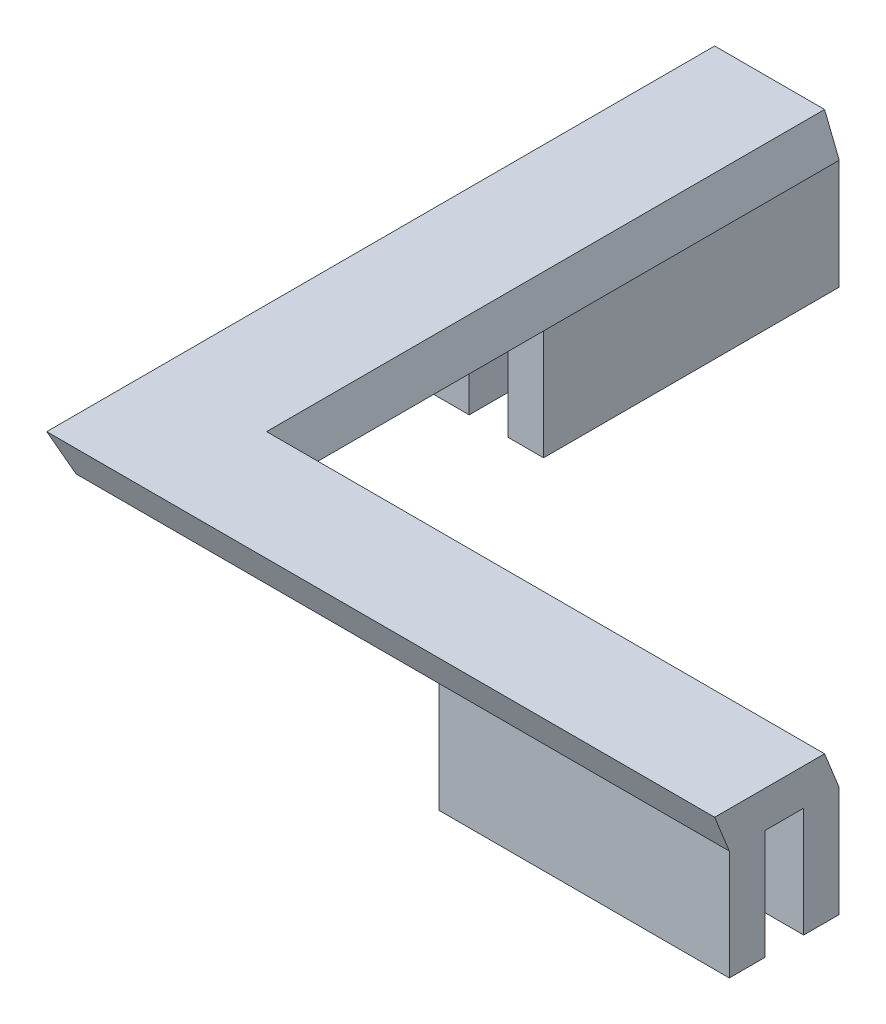
ISO-10303-21;
HEADER;
FILE_DESCRIPTION(('STEP AP214'),'2;1');
FILE_NAME('part.step','',(''),(''),'','','');
FILE_SCHEMA(('AUTOMOTIVE_DESIGN { 1 0 10303 214 1 1 1 1 }'));
ENDSEC;
DATA;
#1=APPLICATION_CONTEXT('core data for automotive mechanical design processes');
#2=APPLICATION_PROTOCOL_DEFINITION('international standard','automotive_design',2000,#1);
#3=PRODUCT_CONTEXT('',#1,'mechanical');
#4=PRODUCT('Part','Part','',(#3));
#5=PRODUCT_RELATED_PRODUCT_CATEGORY('part','',(#4));
#6=PRODUCT_DEFINITION_FORMATION('','',#4);
#7=PRODUCT_DEFINITION_CONTEXT('part definition',#1,'design');
#8=PRODUCT_DEFINITION('design','',#6,#7);
#9=PRODUCT_DEFINITION_SHAPE('','',#8);
#10=(LENGTH_UNIT() NAMED_UNIT(*) SI_UNIT(.MILLI.,.METRE.));
#11=(NAMED_UNIT(*) PLANE_ANGLE_UNIT() SI_UNIT($,.RADIAN.));
#12=(NAMED_UNIT(*) SI_UNIT($,.STERADIAN.) SOLID_ANGLE_UNIT());
#13=UNCERTAINTY_MEASURE_WITH_UNIT(LENGTH_MEASURE(1.E-05),#10,'distance_accuracy_value','');
#14=(GEOMETRIC_REPRESENTATION_CONTEXT(3) GLOBAL_UNCERTAINTY_ASSIGNED_CONTEXT((#13)) GLOBAL_UNIT_ASSIGNED_CONTEXT((#10,
#11,#12)) REPRESENTATION_CONTEXT('',''));
#15=CARTESIAN_POINT('',(0.,0.,0.));
#16=DIRECTION('',(0.,0.,1.));
#17=DIRECTION('',(1.,0.,0.));
#18=AXIS2_PLACEMENT_3D('',#15,#16,#17);
#19=CARTESIAN_POINT('',(0.,0.,0.));
#20=DIRECTION('',(0.,1.,0.));
#21=DIRECTION('',(0.,0.,1.));
#22=AXIS2_PLACEMENT_3D('',#19,#20,#21);
#23=PLANE('',#22);
#24=DIRECTION('',(0.,0.,-1.));
#25=VECTOR('',#24,1.);
#26=CARTESIAN_POINT('',(113.220499999994,0.,0.));
#27=LINE('',#26,#25);
#28=CARTESIAN_POINT('',(113.220499999994,0.,-6.15949999999999));
#29=VERTEX_POINT('',#28);
#30=CARTESIAN_POINT('',(113.220499999994,0.,-12.8905));
#31=VERTEX_POINT('',#30);
#32=EDGE_CURVE('E211',#29,#31,#27,.T.);
#33=ORIENTED_EDGE('',*,*,#32,.F.);
#34=DIRECTION('',(1.,0.,0.));
#35=VECTOR('',#34,1.);
#36=CARTESIAN_POINT('',(164.464999999989,0.,-6.15949999999999));
#37=LINE('',#36,#35);
#38=CARTESIAN_POINT('',(62.8649999999887,0.,-6.1595));
#39=VERTEX_POINT('',#38);
#40=EDGE_CURVE('E285',#39,#29,#37,.T.);
#41=ORIENTED_EDGE('',*,*,#40,.F.);
#42=DIRECTION('',(0.,0.,-1.));
#43=VECTOR('',#42,1.);
#44=CARTESIAN_POINT('',(62.8649999999887,0.,-6.1595));
#45=LINE('',#44,#43);
#46=CARTESIAN_POINT('',(62.8649999999887,0.,0.));
#47=VERTEX_POINT('',#46);
#48=EDGE_CURVE('E288',#47,#39,#45,.T.);
#49=ORIENTED_EDGE('',*,*,#48,.F.);
#50=DIRECTION('',(1.,0.,0.));
#51=VECTOR('',#50,1.);
#52=CARTESIAN_POINT('',(0.,0.,0.));
#53=LINE('',#52,#51);
#54=CARTESIAN_POINT('',(0.,0.,0.));
#55=VERTEX_POINT('',#54);
#56=EDGE_CURVE('E472',#55,#47,#53,.T.);
#57=ORIENTED_EDGE('',*,*,#56,.F.);
#58=DIRECTION('',(0.,0.,-1.));
#59=VECTOR('',#58,1.);
#60=CARTESIAN_POINT('',(0.,0.,0.));
#61=LINE('',#60,#59);
#62=CARTESIAN_POINT('',(0.,0.,-61.976));
#63=VERTEX_POINT('',#62);
#64=EDGE_CURVE('E333',#55,#63,#61,.T.);
#65=ORIENTED_EDGE('',*,*,#64,.T.);
#66=DIRECTION('',(-1.,0.,0.));
#67=VECTOR('',#66,1.);
#68=CARTESIAN_POINT('',(0.,0.,-61.976));
#69=LINE('',#68,#67);
#70=CARTESIAN_POINT('',(6.1595,0.,-61.976));
#71=VERTEX_POINT('',#70);
#72=EDGE_CURVE('E323',#71,#63,#69,.T.);
#73=ORIENTED_EDGE('',*,*,#72,.F.);
#74=DIRECTION('',(0.,0.,1.));
#75=VECTOR('',#74,1.);
#76=CARTESIAN_POINT('',(6.1595,0.,-61.976));
#77=LINE('',#76,#75);
#78=CARTESIAN_POINT('',(6.1595,0.,-113.220499999994));
#79=VERTEX_POINT('',#78);
#80=EDGE_CURVE('E321',#79,#71,#77,.T.);
#81=ORIENTED_EDGE('',*,*,#80,.F.);
#82=DIRECTION('',(-1.,0.,0.));
#83=VECTOR('',#82,1.);
#84=CARTESIAN_POINT('',(0.,0.,-113.220499999994));
#85=LINE('',#84,#83);
#86=CARTESIAN_POINT('',(12.8905,0.,-113.220499999994));
#87=VERTEX_POINT('',#86);
#88=EDGE_CURVE('E238',#87,#79,#85,.T.);
#89=ORIENTED_EDGE('',*,*,#88,.F.);
#90=DIRECTION('',(0.,0.,-1.));
#91=VECTOR('',#90,1.);
#92=CARTESIAN_POINT('',(12.8905,0.,-61.976));
#93=LINE('',#92,#91);
#94=CARTESIAN_POINT('',(12.8905,0.,-61.976));
#95=VERTEX_POINT('',#94);
#96=EDGE_CURVE('E302',#95,#87,#93,.T.);
#97=ORIENTED_EDGE('',*,*,#96,.F.);
#98=DIRECTION('',(-1.,0.,0.));
#99=VECTOR('',#98,1.);
#100=CARTESIAN_POINT('',(19.05,0.,-61.9759999999999));
#101=LINE('',#100,#99);
#102=CARTESIAN_POINT('',(19.05,0.,-61.9759999999999));
#103=VERTEX_POINT('',#102);
#104=EDGE_CURVE('E305',#103,#95,#101,.T.);
#105=ORIENTED_EDGE('',*,*,#104,.F.);
#106=DIRECTION('',(0.,0.,-1.));
#107=VECTOR('',#106,1.);
#108=CARTESIAN_POINT('',(19.05,0.,-19.05));
#109=LINE('',#108,#107);
#110=CARTESIAN_POINT('',(19.05,0.,-19.05));
#111=VERTEX_POINT('',#110);
#112=EDGE_CURVE('E495',#111,#103,#109,.T.);
#113=ORIENTED_EDGE('',*,*,#112,.F.);
#114=DIRECTION('',(-1.,0.,0.));
#115=VECTOR('',#114,1.);
#116=CARTESIAN_POINT('',(208.28,0.,-19.05));
#117=LINE('',#116,#115);
#118=CARTESIAN_POINT('',(62.8649999999887,0.,-19.05));
#119=VERTEX_POINT('',#118);
#120=EDGE_CURVE('E498',#119,#111,#117,.T.);
#121=ORIENTED_EDGE('',*,*,#120,.F.);
#122=DIRECTION('',(0.,0.,-1.));
#123=VECTOR('',#122,1.);
#124=CARTESIAN_POINT('',(62.8649999999888,0.,-12.8905));
#125=LINE('',#124,#123);
#126=CARTESIAN_POINT('',(62.8649999999888,0.,-12.8905));
#127=VERTEX_POINT('',#126);
#128=EDGE_CURVE('E284',#127,#119,#125,.T.);
#129=ORIENTED_EDGE('',*,*,#128,.F.);
#130=DIRECTION('',(-1.,0.,0.));
#131=VECTOR('',#130,1.);
#132=CARTESIAN_POINT('',(164.464999999989,0.,-12.8905));
#133=LINE('',#132,#131);
#134=EDGE_CURVE('E271',#31,#127,#133,.T.);
#135=ORIENTED_EDGE('',*,*,#134,.F.);
#136=EDGE_LOOP('',(#33,#41,#49,#57,#65,#73,#81,#89,#97,#105,#113,#121,#129,#135));
#137=FACE_BOUND('',#136,.T.);
#138=ADVANCED_FACE('F57',(#137),#23,.F.);
#139=CARTESIAN_POINT('',(0.,0.,0.));
#140=DIRECTION('',(0.,-0.371390676354104,0.928476690885259));
#141=DIRECTION('',(0.,-0.928476690885259,-0.371390676354104));
#142=AXIS2_PLACEMENT_3D('',#139,#140,#141);
#143=PLANE('',#142);
#144=DIRECTION('',(1.,0.,0.));
#145=VECTOR('',#144,1.);
#146=CARTESIAN_POINT('',(0.,6.35,2.54));
#147=LINE('',#146,#145);
#148=CARTESIAN_POINT('',(-2.53999999999998,6.34999999999998,2.53999999999999));
#149=VERTEX_POINT('',#148);
#150=CARTESIAN_POINT('',(113.220499999994,6.35,2.54));
#151=VERTEX_POINT('',#150);
#152=EDGE_CURVE('E73',#149,#151,#147,.T.);
#153=ORIENTED_EDGE('',*,*,#152,.F.);
#154=DIRECTION('',(0.348155311911396,-0.870388279778489,-0.348155311911396));
#155=VECTOR('',#154,1.);
#156=CARTESIAN_POINT('',(-50.8,127.,50.8));
#157=LINE('',#156,#155);
#158=EDGE_CURVE('E61',#149,#55,#157,.T.);
#159=ORIENTED_EDGE('',*,*,#158,.T.);
#160=ORIENTED_EDGE('',*,*,#56,.T.);
#161=DIRECTION('',(-1.,0.,0.));
#162=VECTOR('',#161,1.);
#163=CARTESIAN_POINT('',(164.464999999989,0.,0.));
#164=LINE('',#163,#162);
#165=CARTESIAN_POINT('',(113.220499999994,0.,0.));
#166=VERTEX_POINT('',#165);
#167=EDGE_CURVE('E218',#166,#47,#164,.T.);
#168=ORIENTED_EDGE('',*,*,#167,.F.);
#169=DIRECTION('',(0.,0.928476690885259,0.371390676354104));
#170=VECTOR('',#169,1.);
#171=CARTESIAN_POINT('',(113.220499999994,0.,0.));
#172=LINE('',#171,#170);
#173=EDGE_CURVE('E226',#166,#151,#172,.T.);
#174=ORIENTED_EDGE('',*,*,#173,.T.);
#175=EDGE_LOOP('',(#153,#159,#160,#168,#174));
#176=FACE_BOUND('',#175,.T.);
#177=ADVANCED_FACE('F454',(#176),#143,.T.);
#178=CARTESIAN_POINT('',(0.,6.56896551724138,-16.4224137931034));
#179=DIRECTION('',(0.,0.371390676354104,-0.928476690885259));
#180=DIRECTION('',(0.,0.928476690885259,0.371390676354104));
#181=AXIS2_PLACEMENT_3D('',#178,#179,#180);
#182=PLANE('',#181);
#183=DIRECTION('',(-1.,0.,0.));
#184=VECTOR('',#183,1.);
#185=CARTESIAN_POINT('',(0.,6.35,-16.51));
#186=LINE('',#185,#184);
#187=CARTESIAN_POINT('',(113.220499999994,6.35,-16.51));
#188=VERTEX_POINT('',#187);
#189=CARTESIAN_POINT('',(16.51,6.35,-16.51));
#190=VERTEX_POINT('',#189);
#191=EDGE_CURVE('E194',#188,#190,#186,.T.);
#192=ORIENTED_EDGE('',*,*,#191,.F.);
#193=DIRECTION('',(0.,-0.928476690885259,-0.371390676354104));
#194=VECTOR('',#193,1.);
#195=CARTESIAN_POINT('',(113.220499999994,6.56896551724138,-16.4224137931034));
#196=LINE('',#195,#194);
#197=CARTESIAN_POINT('',(113.220499999994,0.,-19.05));
#198=VERTEX_POINT('',#197);
#199=EDGE_CURVE('E202',#188,#198,#196,.T.);
#200=ORIENTED_EDGE('',*,*,#199,.T.);
#201=DIRECTION('',(1.,0.,0.));
#202=VECTOR('',#201,1.);
#203=CARTESIAN_POINT('',(164.464999999989,0.,-19.05));
#204=LINE('',#203,#202);
#205=EDGE_CURVE('E273',#119,#198,#204,.T.);
#206=ORIENTED_EDGE('',*,*,#205,.F.);
#207=ORIENTED_EDGE('',*,*,#120,.T.);
#208=DIRECTION('',(-0.348155311911396,0.870388279778489,0.348155311911396));
#209=VECTOR('',#208,1.);
#210=CARTESIAN_POINT('',(19.05,0.,-19.05));
#211=LINE('',#210,#209);
#212=EDGE_CURVE('E205',#111,#190,#211,.T.);
#213=ORIENTED_EDGE('',*,*,#212,.T.);
#214=EDGE_LOOP('',(#192,#200,#206,#207,#213));
#215=FACE_BOUND('',#214,.T.);
#216=ADVANCED_FACE('F200',(#215),#182,.T.);
#217=CARTESIAN_POINT('',(164.464999999989,-19.05,-6.15949999999999));
#218=DIRECTION('',(0.,0.,1.));
#219=DIRECTION('',(1.,0.,0.));
#220=AXIS2_PLACEMENT_3D('',#217,#218,#219);
#221=PLANE('',#220);
#222=DIRECTION('',(0.,1.,0.));
#223=VECTOR('',#222,1.);
#224=CARTESIAN_POINT('',(113.220499999994,-19.05,-6.15949999999999));
#225=LINE('',#224,#223);
#226=CARTESIAN_POINT('',(113.220499999994,-19.05,-6.15949999999999));
#227=VERTEX_POINT('',#226);
#228=EDGE_CURVE('E213',#227,#29,#225,.T.);
#229=ORIENTED_EDGE('',*,*,#228,.F.);
#230=DIRECTION('',(1.,0.,0.));
#231=VECTOR('',#230,1.);
#232=CARTESIAN_POINT('',(164.464999999989,-19.05,-6.15949999999999));
#233=LINE('',#232,#231);
#234=CARTESIAN_POINT('',(62.8649999999887,-19.05,-6.1595));
#235=VERTEX_POINT('',#234);
#236=EDGE_CURVE('E291',#235,#227,#233,.T.);
#237=ORIENTED_EDGE('',*,*,#236,.F.);
#238=DIRECTION('',(0.,1.,0.));
#239=VECTOR('',#238,1.);
#240=CARTESIAN_POINT('',(62.8649999999887,-19.05,-6.1595));
#241=LINE('',#240,#239);
#242=EDGE_CURVE('E281',#235,#39,#241,.T.);
#243=ORIENTED_EDGE('',*,*,#242,.T.);
#244=ORIENTED_EDGE('',*,*,#40,.T.);
#245=EDGE_LOOP('',(#229,#237,#243,#244));
#246=FACE_BOUND('',#245,.T.);
#247=ADVANCED_FACE('F378',(#246),#221,.F.);
#248=CARTESIAN_POINT('',(164.464999999989,-19.05,0.));
#249=DIRECTION('',(0.,0.,-1.));
#250=DIRECTION('',(-1.,0.,0.));
#251=AXIS2_PLACEMENT_3D('',#248,#249,#250);
#252=PLANE('',#251);
#253=DIRECTION('',(0.,-1.,0.));
#254=VECTOR('',#253,1.);
#255=CARTESIAN_POINT('',(113.220499999994,-19.05,0.));
#256=LINE('',#255,#254);
#257=CARTESIAN_POINT('',(113.220499999994,-19.05,0.));
#258=VERTEX_POINT('',#257);
#259=EDGE_CURVE('E233',#166,#258,#256,.T.);
#260=ORIENTED_EDGE('',*,*,#259,.F.);
#261=ORIENTED_EDGE('',*,*,#167,.T.);
#262=DIRECTION('',(0.,1.,0.));
#263=VECTOR('',#262,1.);
#264=CARTESIAN_POINT('',(62.8649999999887,-19.05,0.));
#265=LINE('',#264,#263);
#266=CARTESIAN_POINT('',(62.8649999999887,-19.05,0.));
#267=VERTEX_POINT('',#266);
#268=EDGE_CURVE('E283',#267,#47,#265,.T.);
#269=ORIENTED_EDGE('',*,*,#268,.F.);
#270=DIRECTION('',(-1.,0.,0.));
#271=VECTOR('',#270,1.);
#272=CARTESIAN_POINT('',(164.464999999989,-19.05,0.));
#273=LINE('',#272,#271);
#274=EDGE_CURVE('E289',#258,#267,#273,.T.);
#275=ORIENTED_EDGE('',*,*,#274,.F.);
#276=EDGE_LOOP('',(#260,#261,#269,#275));
#277=FACE_BOUND('',#276,.T.);
#278=ADVANCED_FACE('F367',(#277),#252,.F.);
#279=CARTESIAN_POINT('',(0.,-19.05,0.));
#280=DIRECTION('',(0.,-1.,0.));
#281=DIRECTION('',(0.,0.,-1.));
#282=AXIS2_PLACEMENT_3D('',#279,#280,#281);
#283=PLANE('',#282);
#284=ORIENTED_EDGE('',*,*,#236,.T.);
#285=DIRECTION('',(0.,0.,1.));
#286=VECTOR('',#285,1.);
#287=CARTESIAN_POINT('',(113.220499999994,-19.05,0.));
#288=LINE('',#287,#286);
#289=EDGE_CURVE('E228',#227,#258,#288,.T.);
#290=ORIENTED_EDGE('',*,*,#289,.T.);
#291=ORIENTED_EDGE('',*,*,#274,.T.);
#292=DIRECTION('',(0.,0.,-1.));
#293=VECTOR('',#292,1.);
#294=CARTESIAN_POINT('',(62.8649999999887,-19.05,-6.1595));
#295=LINE('',#294,#293);
#296=EDGE_CURVE('E294',#267,#235,#295,.T.);
#297=ORIENTED_EDGE('',*,*,#296,.T.);
#298=EDGE_LOOP('',(#284,#290,#291,#297));
#299=FACE_BOUND('',#298,.T.);
#300=ADVANCED_FACE('F377',(#299),#283,.T.);
#301=CARTESIAN_POINT('',(164.464999999989,-19.05,-19.05));
#302=DIRECTION('',(0.,0.,1.));
#303=DIRECTION('',(1.,0.,0.));
#304=AXIS2_PLACEMENT_3D('',#301,#302,#303);
#305=PLANE('',#304);
#306=DIRECTION('',(0.,1.,0.));
#307=VECTOR('',#306,1.);
#308=CARTESIAN_POINT('',(113.220499999994,-19.05,-19.05));
#309=LINE('',#308,#307);
#310=CARTESIAN_POINT('',(113.220499999994,-19.05,-19.05));
#311=VERTEX_POINT('',#310);
#312=EDGE_CURVE('E209',#311,#198,#309,.T.);
#313=ORIENTED_EDGE('',*,*,#312,.F.);
#314=DIRECTION('',(1.,0.,0.));
#315=VECTOR('',#314,1.);
#316=CARTESIAN_POINT('',(164.464999999989,-19.05,-19.05));
#317=LINE('',#316,#315);
#318=CARTESIAN_POINT('',(62.8649999999887,-19.05,-19.05));
#319=VERTEX_POINT('',#318);
#320=EDGE_CURVE('E276',#319,#311,#317,.T.);
#321=ORIENTED_EDGE('',*,*,#320,.F.);
#322=DIRECTION('',(0.,1.,0.));
#323=VECTOR('',#322,1.);
#324=CARTESIAN_POINT('',(62.8649999999887,-19.05,-19.05));
#325=LINE('',#324,#323);
#326=EDGE_CURVE('E264',#319,#119,#325,.T.);
#327=ORIENTED_EDGE('',*,*,#326,.T.);
#328=ORIENTED_EDGE('',*,*,#205,.T.);
#329=EDGE_LOOP('',(#313,#321,#327,#328));
#330=FACE_BOUND('',#329,.T.);
#331=ADVANCED_FACE('F381',(#330),#305,.F.);
#332=CARTESIAN_POINT('',(164.464999999989,-19.05,-12.8905));
#333=DIRECTION('',(0.,0.,-1.));
#334=DIRECTION('',(-1.,0.,0.));
#335=AXIS2_PLACEMENT_3D('',#332,#333,#334);
#336=PLANE('',#335);
#337=DIRECTION('',(0.,-1.,0.));
#338=VECTOR('',#337,1.);
#339=CARTESIAN_POINT('',(113.220499999994,-19.05,-12.8905));
#340=LINE('',#339,#338);
#341=CARTESIAN_POINT('',(113.220499999994,-19.05,-12.8905));
#342=VERTEX_POINT('',#341);
#343=EDGE_CURVE('E81',#31,#342,#340,.T.);
#344=ORIENTED_EDGE('',*,*,#343,.F.);
#345=ORIENTED_EDGE('',*,*,#134,.T.);
#346=DIRECTION('',(0.,1.,0.));
#347=VECTOR('',#346,1.);
#348=CARTESIAN_POINT('',(62.8649999999888,-19.05,-12.8905));
#349=LINE('',#348,#347);
#350=CARTESIAN_POINT('',(62.8649999999888,-19.05,-12.8905));
#351=VERTEX_POINT('',#350);
#352=EDGE_CURVE('E267',#351,#127,#349,.T.);
#353=ORIENTED_EDGE('',*,*,#352,.F.);
#354=DIRECTION('',(-1.,0.,0.));
#355=VECTOR('',#354,1.);
#356=CARTESIAN_POINT('',(164.464999999989,-19.05,-12.8905));
#357=LINE('',#356,#355);
#358=EDGE_CURVE('E270',#342,#351,#357,.T.);
#359=ORIENTED_EDGE('',*,*,#358,.F.);
#360=EDGE_LOOP('',(#344,#345,#353,#359));
#361=FACE_BOUND('',#360,.T.);
#362=ADVANCED_FACE('F572',(#361),#336,.F.);
#363=CARTESIAN_POINT('',(0.,-19.05,0.));
#364=DIRECTION('',(0.,1.,0.));
#365=DIRECTION('',(0.,0.,1.));
#366=AXIS2_PLACEMENT_3D('',#363,#364,#365);
#367=PLANE('',#366);
#368=DIRECTION('',(0.,0.,-1.));
#369=VECTOR('',#368,1.);
#370=CARTESIAN_POINT('',(113.220499999994,-19.05,0.));
#371=LINE('',#370,#369);
#372=EDGE_CURVE('E67',#342,#311,#371,.T.);
#373=ORIENTED_EDGE('',*,*,#372,.F.);
#374=ORIENTED_EDGE('',*,*,#358,.T.);
#375=DIRECTION('',(0.,0.,-1.));
#376=VECTOR('',#375,1.);
#377=CARTESIAN_POINT('',(62.8649999999888,-19.05,-12.8905));
#378=LINE('',#377,#376);
#379=EDGE_CURVE('E274',#351,#319,#378,.T.);
#380=ORIENTED_EDGE('',*,*,#379,.T.);
#381=ORIENTED_EDGE('',*,*,#320,.T.);
#382=EDGE_LOOP('',(#373,#374,#380,#381));
#383=FACE_BOUND('',#382,.T.);
#384=ADVANCED_FACE('F451',(#383),#367,.F.);
#385=CARTESIAN_POINT('',(0.,0.,0.));
#386=DIRECTION('',(0.928476690885259,0.371390676354104,0.));
#387=DIRECTION('',(-0.371390676354104,0.928476690885259,0.));
#388=AXIS2_PLACEMENT_3D('',#385,#386,#387);
#389=PLANE('',#388);
#390=ORIENTED_EDGE('',*,*,#158,.F.);
#391=DIRECTION('',(0.,0.,-1.));
#392=VECTOR('',#391,1.);
#393=CARTESIAN_POINT('',(-2.54,6.35,0.));
#394=LINE('',#393,#392);
#395=CARTESIAN_POINT('',(-2.54,6.35,-113.220499999994));
#396=VERTEX_POINT('',#395);
#397=EDGE_CURVE('E795',#149,#396,#394,.T.);
#398=ORIENTED_EDGE('',*,*,#397,.T.);
#399=DIRECTION('',(-0.371390676354104,0.928476690885259,0.));
#400=VECTOR('',#399,1.);
#401=CARTESIAN_POINT('',(0.,0.,-113.220499999994));
#402=LINE('',#401,#400);
#403=CARTESIAN_POINT('',(0.,0.,-113.220499999994));
#404=VERTEX_POINT('',#403);
#405=EDGE_CURVE('E259',#404,#396,#402,.T.);
#406=ORIENTED_EDGE('',*,*,#405,.F.);
#407=DIRECTION('',(0.,0.,-1.));
#408=VECTOR('',#407,1.);
#409=CARTESIAN_POINT('',(0.,0.,-61.976));
#410=LINE('',#409,#408);
#411=EDGE_CURVE('E315',#63,#404,#410,.T.);
#412=ORIENTED_EDGE('',*,*,#411,.F.);
#413=ORIENTED_EDGE('',*,*,#64,.F.);
#414=EDGE_LOOP('',(#390,#398,#406,#412,#413));
#415=FACE_BOUND('',#414,.T.);
#416=ADVANCED_FACE('F441',(#415),#389,.F.);
#417=CARTESIAN_POINT('',(16.4224137931034,6.56896551724138,0.));
#418=DIRECTION('',(0.928476690885259,0.371390676354104,0.));
#419=DIRECTION('',(-0.371390676354104,0.928476690885259,0.));
#420=AXIS2_PLACEMENT_3D('',#417,#418,#419);
#421=PLANE('',#420);
#422=DIRECTION('',(0.,0.,-1.));
#423=VECTOR('',#422,1.);
#424=CARTESIAN_POINT('',(16.51,6.35,0.));
#425=LINE('',#424,#423);
#426=CARTESIAN_POINT('',(16.51,6.35,-113.220499999994));
#427=VERTEX_POINT('',#426);
#428=EDGE_CURVE('E798',#190,#427,#425,.T.);
#429=ORIENTED_EDGE('',*,*,#428,.F.);
#430=ORIENTED_EDGE('',*,*,#212,.F.);
#431=ORIENTED_EDGE('',*,*,#112,.T.);
#432=DIRECTION('',(0.,0.,1.));
#433=VECTOR('',#432,1.);
#434=CARTESIAN_POINT('',(19.05,0.,-61.9759999999999));
#435=LINE('',#434,#433);
#436=CARTESIAN_POINT('',(19.05,0.,-113.220499999994));
#437=VERTEX_POINT('',#436);
#438=EDGE_CURVE('E324',#437,#103,#435,.T.);
#439=ORIENTED_EDGE('',*,*,#438,.F.);
#440=DIRECTION('',(-0.371390676354104,0.928476690885259,0.));
#441=VECTOR('',#440,1.);
#442=CARTESIAN_POINT('',(16.4224137931034,6.56896551724138,-113.220499999994));
#443=LINE('',#442,#441);
#444=EDGE_CURVE('E241',#437,#427,#443,.T.);
#445=ORIENTED_EDGE('',*,*,#444,.T.);
#446=EDGE_LOOP('',(#429,#430,#431,#439,#445));
#447=FACE_BOUND('',#446,.T.);
#448=ADVANCED_FACE('F450',(#447),#421,.T.);
#449=CARTESIAN_POINT('',(6.1595,-19.05,-61.976));
#450=DIRECTION('',(-1.,0.,0.));
#451=DIRECTION('',(0.,0.,1.));
#452=AXIS2_PLACEMENT_3D('',#449,#450,#451);
#453=PLANE('',#452);
#454=DIRECTION('',(0.,-1.,0.));
#455=VECTOR('',#454,1.);
#456=CARTESIAN_POINT('',(6.1595,-19.05,-113.220499999994));
#457=LINE('',#456,#455);
#458=CARTESIAN_POINT('',(6.1595,-19.05,-113.220499999994));
#459=VERTEX_POINT('',#458);
#460=EDGE_CURVE('E240',#79,#459,#457,.T.);
#461=ORIENTED_EDGE('',*,*,#460,.F.);
#462=ORIENTED_EDGE('',*,*,#80,.T.);
#463=DIRECTION('',(0.,1.,0.));
#464=VECTOR('',#463,1.);
#465=CARTESIAN_POINT('',(6.1595,-19.05,-61.976));
#466=LINE('',#465,#464);
#467=CARTESIAN_POINT('',(6.1595,-19.05,-61.976));
#468=VERTEX_POINT('',#467);
#469=EDGE_CURVE('E327',#468,#71,#466,.T.);
#470=ORIENTED_EDGE('',*,*,#469,.F.);
#471=DIRECTION('',(0.,0.,1.));
#472=VECTOR('',#471,1.);
#473=CARTESIAN_POINT('',(6.1595,-19.05,-61.976));
#474=LINE('',#473,#472);
#475=EDGE_CURVE('E312',#459,#468,#474,.T.);
#476=ORIENTED_EDGE('',*,*,#475,.F.);
#477=EDGE_LOOP('',(#461,#462,#470,#476));
#478=FACE_BOUND('',#477,.T.);
#479=ADVANCED_FACE('F410',(#478),#453,.F.);
#480=CARTESIAN_POINT('',(0.,-19.05,-61.976));
#481=DIRECTION('',(1.,0.,0.));
#482=DIRECTION('',(0.,0.,-1.));
#483=AXIS2_PLACEMENT_3D('',#480,#481,#482);
#484=PLANE('',#483);
#485=DIRECTION('',(0.,1.,0.));
#486=VECTOR('',#485,1.);
#487=CARTESIAN_POINT('',(0.,-19.05,-113.220499999994));
#488=LINE('',#487,#486);
#489=CARTESIAN_POINT('',(0.,-19.05,-113.220499999994));
#490=VERTEX_POINT('',#489);
#491=EDGE_CURVE('E257',#490,#404,#488,.T.);
#492=ORIENTED_EDGE('',*,*,#491,.F.);
#493=DIRECTION('',(0.,0.,-1.));
#494=VECTOR('',#493,1.);
#495=CARTESIAN_POINT('',(0.,-19.05,-61.976));
#496=LINE('',#495,#494);
#497=CARTESIAN_POINT('',(0.,-19.05,-61.976));
#498=VERTEX_POINT('',#497);
#499=EDGE_CURVE('E317',#498,#490,#496,.T.);
#500=ORIENTED_EDGE('',*,*,#499,.F.);
#501=DIRECTION('',(0.,1.,0.));
#502=VECTOR('',#501,1.);
#503=CARTESIAN_POINT('',(0.,-19.05,-61.976));
#504=LINE('',#503,#502);
#505=EDGE_CURVE('E320',#498,#63,#504,.T.);
#506=ORIENTED_EDGE('',*,*,#505,.T.);
#507=ORIENTED_EDGE('',*,*,#411,.T.);
#508=EDGE_LOOP('',(#492,#500,#506,#507));
#509=FACE_BOUND('',#508,.T.);
#510=ADVANCED_FACE('F405',(#509),#484,.F.);
#511=CARTESIAN_POINT('',(0.,-19.05,0.));
#512=DIRECTION('',(0.,-1.,0.));
#513=DIRECTION('',(0.,0.,-1.));
#514=AXIS2_PLACEMENT_3D('',#511,#512,#513);
#515=PLANE('',#514);
#516=ORIENTED_EDGE('',*,*,#499,.T.);
#517=DIRECTION('',(1.,0.,0.));
#518=VECTOR('',#517,1.);
#519=CARTESIAN_POINT('',(0.,-19.05,-113.220499999994));
#520=LINE('',#519,#518);
#521=EDGE_CURVE('E254',#490,#459,#520,.T.);
#522=ORIENTED_EDGE('',*,*,#521,.T.);
#523=ORIENTED_EDGE('',*,*,#475,.T.);
#524=DIRECTION('',(-1.,0.,0.));
#525=VECTOR('',#524,1.);
#526=CARTESIAN_POINT('',(0.,-19.05,-61.976));
#527=LINE('',#526,#525);
#528=EDGE_CURVE('E314',#468,#498,#527,.T.);
#529=ORIENTED_EDGE('',*,*,#528,.T.);
#530=EDGE_LOOP('',(#516,#522,#523,#529));
#531=FACE_BOUND('',#530,.T.);
#532=ADVANCED_FACE('F388',(#531),#515,.T.);
#533=CARTESIAN_POINT('',(19.05,-19.05,-61.9759999999999));
#534=DIRECTION('',(-1.,0.,0.));
#535=DIRECTION('',(0.,0.,1.));
#536=AXIS2_PLACEMENT_3D('',#533,#534,#535);
#537=PLANE('',#536);
#538=DIRECTION('',(0.,-1.,0.));
#539=VECTOR('',#538,1.);
#540=CARTESIAN_POINT('',(19.05,-19.05,-113.220499999994));
#541=LINE('',#540,#539);
#542=CARTESIAN_POINT('',(19.05,-19.05,-113.220499999994));
#543=VERTEX_POINT('',#542);
#544=EDGE_CURVE('E245',#437,#543,#541,.T.);
#545=ORIENTED_EDGE('',*,*,#544,.F.);
#546=ORIENTED_EDGE('',*,*,#438,.T.);
#547=DIRECTION('',(0.,1.,0.));
#548=VECTOR('',#547,1.);
#549=CARTESIAN_POINT('',(19.05,-19.05,-61.9759999999999));
#550=LINE('',#549,#548);
#551=CARTESIAN_POINT('',(19.05,-19.05,-61.9759999999999));
#552=VERTEX_POINT('',#551);
#553=EDGE_CURVE('E301',#552,#103,#550,.T.);
#554=ORIENTED_EDGE('',*,*,#553,.F.);
#555=DIRECTION('',(0.,0.,1.));
#556=VECTOR('',#555,1.);
#557=CARTESIAN_POINT('',(19.05,-19.05,-61.9759999999999));
#558=LINE('',#557,#556);
#559=EDGE_CURVE('E306',#543,#552,#558,.T.);
#560=ORIENTED_EDGE('',*,*,#559,.F.);
#561=EDGE_LOOP('',(#545,#546,#554,#560));
#562=FACE_BOUND('',#561,.T.);
#563=ADVANCED_FACE('F383',(#562),#537,.F.);
#564=CARTESIAN_POINT('',(12.8905,-19.05,-61.976));
#565=DIRECTION('',(1.,0.,0.));
#566=DIRECTION('',(0.,0.,-1.));
#567=AXIS2_PLACEMENT_3D('',#564,#565,#566);
#568=PLANE('',#567);
#569=DIRECTION('',(0.,1.,0.));
#570=VECTOR('',#569,1.);
#571=CARTESIAN_POINT('',(12.8905,-19.05,-113.220499999994));
#572=LINE('',#571,#570);
#573=CARTESIAN_POINT('',(12.8905,-19.05,-113.220499999994));
#574=VERTEX_POINT('',#573);
#575=EDGE_CURVE('E243',#574,#87,#572,.T.);
#576=ORIENTED_EDGE('',*,*,#575,.F.);
#577=DIRECTION('',(0.,0.,-1.));
#578=VECTOR('',#577,1.);
#579=CARTESIAN_POINT('',(12.8905,-19.05,-61.976));
#580=LINE('',#579,#578);
#581=CARTESIAN_POINT('',(12.8905,-19.05,-61.976));
#582=VERTEX_POINT('',#581);
#583=EDGE_CURVE('E300',#582,#574,#580,.T.);
#584=ORIENTED_EDGE('',*,*,#583,.F.);
#585=DIRECTION('',(0.,1.,0.));
#586=VECTOR('',#585,1.);
#587=CARTESIAN_POINT('',(12.8905,-19.05,-61.976));
#588=LINE('',#587,#586);
#589=EDGE_CURVE('E297',#582,#95,#588,.T.);
#590=ORIENTED_EDGE('',*,*,#589,.T.);
#591=ORIENTED_EDGE('',*,*,#96,.T.);
#592=EDGE_LOOP('',(#576,#584,#590,#591));
#593=FACE_BOUND('',#592,.T.);
#594=ADVANCED_FACE('F387',(#593),#568,.F.);
#595=CARTESIAN_POINT('',(0.,-19.05,0.));
#596=DIRECTION('',(0.,1.,0.));
#597=DIRECTION('',(0.,0.,1.));
#598=AXIS2_PLACEMENT_3D('',#595,#596,#597);
#599=PLANE('',#598);
#600=DIRECTION('',(-1.,0.,0.));
#601=VECTOR('',#600,1.);
#602=CARTESIAN_POINT('',(0.,-19.05,-113.220499999994));
#603=LINE('',#602,#601);
#604=EDGE_CURVE('E235',#543,#574,#603,.T.);
#605=ORIENTED_EDGE('',*,*,#604,.F.);
#606=ORIENTED_EDGE('',*,*,#559,.T.);
#607=DIRECTION('',(-1.,0.,0.));
#608=VECTOR('',#607,1.);
#609=CARTESIAN_POINT('',(19.05,-19.05,-61.9759999999999));
#610=LINE('',#609,#608);
#611=EDGE_CURVE('E309',#552,#582,#610,.T.);
#612=ORIENTED_EDGE('',*,*,#611,.T.);
#613=ORIENTED_EDGE('',*,*,#583,.T.);
#614=EDGE_LOOP('',(#605,#606,#612,#613));
#615=FACE_BOUND('',#614,.T.);
#616=ADVANCED_FACE('F398',(#615),#599,.F.);
#617=CARTESIAN_POINT('',(0.,-19.05,-61.976));
#618=DIRECTION('',(0.,0.,-1.));
#619=DIRECTION('',(-1.,0.,0.));
#620=AXIS2_PLACEMENT_3D('',#617,#618,#619);
#621=PLANE('',#620);
#622=ORIENTED_EDGE('',*,*,#72,.T.);
#623=ORIENTED_EDGE('',*,*,#505,.F.);
#624=ORIENTED_EDGE('',*,*,#528,.F.);
#625=ORIENTED_EDGE('',*,*,#469,.T.);
#626=EDGE_LOOP('',(#622,#623,#624,#625));
#627=FACE_BOUND('',#626,.T.);
#628=ADVANCED_FACE('F394',(#627),#621,.F.);
#629=CARTESIAN_POINT('',(19.05,-19.05,-61.9759999999999));
#630=DIRECTION('',(0.,0.,-1.));
#631=DIRECTION('',(-1.,0.,0.));
#632=AXIS2_PLACEMENT_3D('',#629,#630,#631);
#633=PLANE('',#632);
#634=ORIENTED_EDGE('',*,*,#104,.T.);
#635=ORIENTED_EDGE('',*,*,#589,.F.);
#636=ORIENTED_EDGE('',*,*,#611,.F.);
#637=ORIENTED_EDGE('',*,*,#553,.T.);
#638=EDGE_LOOP('',(#634,#635,#636,#637));
#639=FACE_BOUND('',#638,.T.);
#640=ADVANCED_FACE('F390',(#639),#633,.F.);
#641=CARTESIAN_POINT('',(62.8649999999887,-19.05,-6.1595));
#642=DIRECTION('',(1.,0.,0.));
#643=DIRECTION('',(0.,0.,-1.));
#644=AXIS2_PLACEMENT_3D('',#641,#642,#643);
#645=PLANE('',#644);
#646=ORIENTED_EDGE('',*,*,#48,.T.);
#647=ORIENTED_EDGE('',*,*,#242,.F.);
#648=ORIENTED_EDGE('',*,*,#296,.F.);
#649=ORIENTED_EDGE('',*,*,#268,.T.);
#650=EDGE_LOOP('',(#646,#647,#648,#649));
#651=FACE_BOUND('',#650,.T.);
#652=ADVANCED_FACE('F393',(#651),#645,.F.);
#653=CARTESIAN_POINT('',(62.8649999999888,-19.05,-12.8905));
#654=DIRECTION('',(1.,0.,0.));
#655=DIRECTION('',(0.,0.,-1.));
#656=AXIS2_PLACEMENT_3D('',#653,#654,#655);
#657=PLANE('',#656);
#658=ORIENTED_EDGE('',*,*,#128,.T.);
#659=ORIENTED_EDGE('',*,*,#326,.F.);
#660=ORIENTED_EDGE('',*,*,#379,.F.);
#661=ORIENTED_EDGE('',*,*,#352,.T.);
#662=EDGE_LOOP('',(#658,#659,#660,#661));
#663=FACE_BOUND('',#662,.T.);
#664=ADVANCED_FACE('F573',(#663),#657,.F.);
#665=CARTESIAN_POINT('',(0.,0.,-113.220499999994));
#666=DIRECTION('',(0.,0.,-1.));
#667=DIRECTION('',(-1.,0.,0.));
#668=AXIS2_PLACEMENT_3D('',#665,#666,#667);
#669=PLANE('',#668);
#670=DIRECTION('',(-1.,0.,0.));
#671=VECTOR('',#670,1.);
#672=CARTESIAN_POINT('',(0.,6.35,-113.220499999994));
#673=LINE('',#672,#671);
#674=EDGE_CURVE('E792',#427,#396,#673,.T.);
#675=ORIENTED_EDGE('',*,*,#674,.F.);
#676=ORIENTED_EDGE('',*,*,#444,.F.);
#677=ORIENTED_EDGE('',*,*,#544,.T.);
#678=ORIENTED_EDGE('',*,*,#604,.T.);
#679=ORIENTED_EDGE('',*,*,#575,.T.);
#680=ORIENTED_EDGE('',*,*,#88,.T.);
#681=ORIENTED_EDGE('',*,*,#460,.T.);
#682=ORIENTED_EDGE('',*,*,#521,.F.);
#683=ORIENTED_EDGE('',*,*,#491,.T.);
#684=ORIENTED_EDGE('',*,*,#405,.T.);
#685=EDGE_LOOP('',(#675,#676,#677,#678,#679,#680,#681,#682,#683,#684));
#686=FACE_BOUND('',#685,.T.);
#687=ADVANCED_FACE('F584',(#686),#669,.T.);
#688=CARTESIAN_POINT('',(113.220499999994,0.,0.));
#689=DIRECTION('',(1.,0.,0.));
#690=DIRECTION('',(0.,0.,-1.));
#691=AXIS2_PLACEMENT_3D('',#688,#689,#690);
#692=PLANE('',#691);
#693=DIRECTION('',(0.,0.,-1.));
#694=VECTOR('',#693,1.);
#695=CARTESIAN_POINT('',(113.220499999994,6.35,0.));
#696=LINE('',#695,#694);
#697=EDGE_CURVE('E12',#151,#188,#696,.T.);
#698=ORIENTED_EDGE('',*,*,#697,.F.);
#699=ORIENTED_EDGE('',*,*,#173,.F.);
#700=ORIENTED_EDGE('',*,*,#259,.T.);
#701=ORIENTED_EDGE('',*,*,#289,.F.);
#702=ORIENTED_EDGE('',*,*,#228,.T.);
#703=ORIENTED_EDGE('',*,*,#32,.T.);
#704=ORIENTED_EDGE('',*,*,#343,.T.);
#705=ORIENTED_EDGE('',*,*,#372,.T.);
#706=ORIENTED_EDGE('',*,*,#312,.T.);
#707=ORIENTED_EDGE('',*,*,#199,.F.);
#708=EDGE_LOOP('',(#698,#699,#700,#701,#702,#703,#704,#705,#706,#707));
#709=FACE_BOUND('',#708,.T.);
#710=ADVANCED_FACE('F207',(#709),#692,.T.);
#711=CARTESIAN_POINT('',(0.,6.35,0.));
#712=DIRECTION('',(0.,-1.,0.));
#713=DIRECTION('',(0.,0.,-1.));
#714=AXIS2_PLACEMENT_3D('',#711,#712,#713);
#715=PLANE('',#714);
#716=ORIENTED_EDGE('',*,*,#674,.T.);
#717=ORIENTED_EDGE('',*,*,#397,.F.);
#718=ORIENTED_EDGE('',*,*,#152,.T.);
#719=ORIENTED_EDGE('',*,*,#697,.T.);
#720=ORIENTED_EDGE('',*,*,#191,.T.);
#721=ORIENTED_EDGE('',*,*,#428,.T.);
#722=EDGE_LOOP('',(#716,#717,#718,#719,#720,#721));
#723=FACE_BOUND('',#722,.T.);
#724=ADVANCED_FACE('F193',(#723),#715,.F.);
#725=CLOSED_SHELL('',(#138,#177,#216,#247,#278,#300,#331,#362,#384,#416,#448,#479,#510,#532,
#563,#594,#616,#628,#640,#652,#664,#687,#710,#724));
#726=MANIFOLD_SOLID_BREP('B2',#725);
#727=ADVANCED_BREP_SHAPE_REPRESENTATION('',(#18,#726),#14);
#728=SHAPE_DEFINITION_REPRESENTATION(#9,#727);
ENDSEC;
END-ISO-10303-21;
